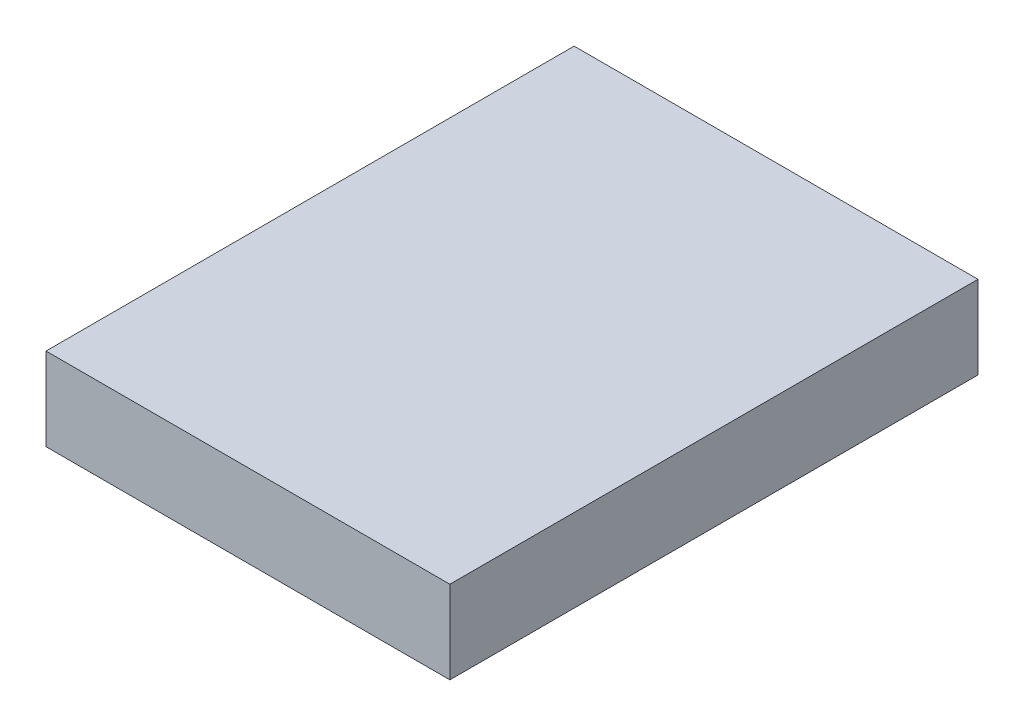
ISO-10303-21;
HEADER;
FILE_DESCRIPTION(('STEP AP214'),'2;1');
FILE_NAME('part.step','',(''),(''),'','','');
FILE_SCHEMA(('AUTOMOTIVE_DESIGN { 1 0 10303 214 1 1 1 1 }'));
ENDSEC;
DATA;
#1=APPLICATION_CONTEXT('core data for automotive mechanical design processes');
#2=APPLICATION_PROTOCOL_DEFINITION('international standard','automotive_design',2000,#1);
#3=PRODUCT_CONTEXT('',#1,'mechanical');
#4=PRODUCT('Part','Part','',(#3));
#5=PRODUCT_RELATED_PRODUCT_CATEGORY('part','',(#4));
#6=PRODUCT_DEFINITION_FORMATION('','',#4);
#7=PRODUCT_DEFINITION_CONTEXT('part definition',#1,'design');
#8=PRODUCT_DEFINITION('design','',#6,#7);
#9=PRODUCT_DEFINITION_SHAPE('','',#8);
#10=(LENGTH_UNIT() NAMED_UNIT(*) SI_UNIT(.MILLI.,.METRE.));
#11=(NAMED_UNIT(*) PLANE_ANGLE_UNIT() SI_UNIT($,.RADIAN.));
#12=(NAMED_UNIT(*) SI_UNIT($,.STERADIAN.) SOLID_ANGLE_UNIT());
#13=UNCERTAINTY_MEASURE_WITH_UNIT(LENGTH_MEASURE(1.E-05),#10,'distance_accuracy_value','');
#14=(GEOMETRIC_REPRESENTATION_CONTEXT(3) GLOBAL_UNCERTAINTY_ASSIGNED_CONTEXT((#13)) GLOBAL_UNIT_ASSIGNED_CONTEXT((#10,
#11,#12)) REPRESENTATION_CONTEXT('',''));
#15=CARTESIAN_POINT('',(0.,0.,0.));
#16=DIRECTION('',(0.,0.,1.));
#17=DIRECTION('',(1.,0.,0.));
#18=AXIS2_PLACEMENT_3D('',#15,#16,#17);
#19=CARTESIAN_POINT('',(19.5,8.,-25.5));
#20=DIRECTION('',(-1.,0.,0.));
#21=DIRECTION('',(0.,0.,1.));
#22=AXIS2_PLACEMENT_3D('',#19,#20,#21);
#23=PLANE('',#22);
#24=DIRECTION('',(0.,0.,-1.));
#25=VECTOR('',#24,1.);
#26=CARTESIAN_POINT('',(19.5,0.,-25.5));
#27=LINE('',#26,#25);
#28=CARTESIAN_POINT('',(19.5,0.,25.5));
#29=VERTEX_POINT('',#28);
#30=CARTESIAN_POINT('',(19.5,0.,-25.5));
#31=VERTEX_POINT('',#30);
#32=EDGE_CURVE('E97',#29,#31,#27,.T.);
#33=ORIENTED_EDGE('',*,*,#32,.T.);
#34=DIRECTION('',(0.,-1.,0.));
#35=VECTOR('',#34,1.);
#36=CARTESIAN_POINT('',(19.5,8.,-25.5));
#37=LINE('',#36,#35);
#38=CARTESIAN_POINT('',(19.5,8.,-25.5));
#39=VERTEX_POINT('',#38);
#40=EDGE_CURVE('E11',#39,#31,#37,.T.);
#41=ORIENTED_EDGE('',*,*,#40,.F.);
#42=DIRECTION('',(0.,0.,-1.));
#43=VECTOR('',#42,1.);
#44=CARTESIAN_POINT('',(19.5,8.,-25.5));
#45=LINE('',#44,#43);
#46=CARTESIAN_POINT('',(19.5,8.,25.5));
#47=VERTEX_POINT('',#46);
#48=EDGE_CURVE('E85',#47,#39,#45,.T.);
#49=ORIENTED_EDGE('',*,*,#48,.F.);
#50=DIRECTION('',(0.,-1.,0.));
#51=VECTOR('',#50,1.);
#52=CARTESIAN_POINT('',(19.5,8.,25.5));
#53=LINE('',#52,#51);
#54=EDGE_CURVE('E93',#47,#29,#53,.T.);
#55=ORIENTED_EDGE('',*,*,#54,.T.);
#56=EDGE_LOOP('',(#33,#41,#49,#55));
#57=FACE_BOUND('',#56,.T.);
#58=ADVANCED_FACE('F34',(#57),#23,.F.);
#59=CARTESIAN_POINT('',(-19.5,8.,-25.5));
#60=DIRECTION('',(0.,0.,1.));
#61=DIRECTION('',(1.,0.,0.));
#62=AXIS2_PLACEMENT_3D('',#59,#60,#61);
#63=PLANE('',#62);
#64=DIRECTION('',(-1.,0.,0.));
#65=VECTOR('',#64,1.);
#66=CARTESIAN_POINT('',(-19.5,0.,-25.5));
#67=LINE('',#66,#65);
#68=CARTESIAN_POINT('',(-19.5,0.,-25.5));
#69=VERTEX_POINT('',#68);
#70=EDGE_CURVE('E89',#31,#69,#67,.T.);
#71=ORIENTED_EDGE('',*,*,#70,.T.);
#72=DIRECTION('',(0.,-1.,0.));
#73=VECTOR('',#72,1.);
#74=CARTESIAN_POINT('',(-19.5,8.,-25.5));
#75=LINE('',#74,#73);
#76=CARTESIAN_POINT('',(-19.5,8.,-25.5));
#77=VERTEX_POINT('',#76);
#78=EDGE_CURVE('E42',#77,#69,#75,.T.);
#79=ORIENTED_EDGE('',*,*,#78,.F.);
#80=DIRECTION('',(-1.,0.,0.));
#81=VECTOR('',#80,1.);
#82=CARTESIAN_POINT('',(-19.5,8.,-25.5));
#83=LINE('',#82,#81);
#84=EDGE_CURVE('E80',#39,#77,#83,.T.);
#85=ORIENTED_EDGE('',*,*,#84,.F.);
#86=ORIENTED_EDGE('',*,*,#40,.T.);
#87=EDGE_LOOP('',(#71,#79,#85,#86));
#88=FACE_BOUND('',#87,.T.);
#89=ADVANCED_FACE('F88',(#88),#63,.F.);
#90=CARTESIAN_POINT('',(-19.5,8.,-25.5));
#91=DIRECTION('',(1.,0.,0.));
#92=DIRECTION('',(0.,0.,-1.));
#93=AXIS2_PLACEMENT_3D('',#90,#91,#92);
#94=PLANE('',#93);
#95=DIRECTION('',(0.,0.,1.));
#96=VECTOR('',#95,1.);
#97=CARTESIAN_POINT('',(-19.5,0.,-25.5));
#98=LINE('',#97,#96);
#99=CARTESIAN_POINT('',(-19.5,0.,25.5));
#100=VERTEX_POINT('',#99);
#101=EDGE_CURVE('E67',#69,#100,#98,.T.);
#102=ORIENTED_EDGE('',*,*,#101,.T.);
#103=DIRECTION('',(0.,-1.,0.));
#104=VECTOR('',#103,1.);
#105=CARTESIAN_POINT('',(-19.5,8.,25.5));
#106=LINE('',#105,#104);
#107=CARTESIAN_POINT('',(-19.5,8.,25.5));
#108=VERTEX_POINT('',#107);
#109=EDGE_CURVE('E90',#108,#100,#106,.T.);
#110=ORIENTED_EDGE('',*,*,#109,.F.);
#111=DIRECTION('',(0.,0.,1.));
#112=VECTOR('',#111,1.);
#113=CARTESIAN_POINT('',(-19.5,8.,-25.5));
#114=LINE('',#113,#112);
#115=EDGE_CURVE('E83',#77,#108,#114,.T.);
#116=ORIENTED_EDGE('',*,*,#115,.F.);
#117=ORIENTED_EDGE('',*,*,#78,.T.);
#118=EDGE_LOOP('',(#102,#110,#116,#117));
#119=FACE_BOUND('',#118,.T.);
#120=ADVANCED_FACE('F91',(#119),#94,.F.);
#121=CARTESIAN_POINT('',(-19.5,8.,25.5));
#122=DIRECTION('',(0.,0.,-1.));
#123=DIRECTION('',(-1.,0.,0.));
#124=AXIS2_PLACEMENT_3D('',#121,#122,#123);
#125=PLANE('',#124);
#126=DIRECTION('',(1.,0.,0.));
#127=VECTOR('',#126,1.);
#128=CARTESIAN_POINT('',(-19.5,0.,25.5));
#129=LINE('',#128,#127);
#130=EDGE_CURVE('E73',#100,#29,#129,.T.);
#131=ORIENTED_EDGE('',*,*,#130,.T.);
#132=ORIENTED_EDGE('',*,*,#54,.F.);
#133=DIRECTION('',(1.,0.,0.));
#134=VECTOR('',#133,1.);
#135=CARTESIAN_POINT('',(-19.5,8.,25.5));
#136=LINE('',#135,#134);
#137=EDGE_CURVE('E50',#108,#47,#136,.T.);
#138=ORIENTED_EDGE('',*,*,#137,.F.);
#139=ORIENTED_EDGE('',*,*,#109,.T.);
#140=EDGE_LOOP('',(#131,#132,#138,#139));
#141=FACE_BOUND('',#140,.T.);
#142=ADVANCED_FACE('F104',(#141),#125,.F.);
#143=CARTESIAN_POINT('',(0.,8.,0.));
#144=DIRECTION('',(0.,1.,0.));
#145=DIRECTION('',(0.,0.,1.));
#146=AXIS2_PLACEMENT_3D('',#143,#144,#145);
#147=PLANE('',#146);
#148=ORIENTED_EDGE('',*,*,#48,.T.);
#149=ORIENTED_EDGE('',*,*,#84,.T.);
#150=ORIENTED_EDGE('',*,*,#115,.T.);
#151=ORIENTED_EDGE('',*,*,#137,.T.);
#152=EDGE_LOOP('',(#148,#149,#150,#151));
#153=FACE_BOUND('',#152,.T.);
#154=ADVANCED_FACE('F81',(#153),#147,.T.);
#155=CARTESIAN_POINT('',(0.,0.,0.));
#156=DIRECTION('',(0.,1.,0.));
#157=DIRECTION('',(0.,0.,1.));
#158=AXIS2_PLACEMENT_3D('',#155,#156,#157);
#159=PLANE('',#158);
#160=ORIENTED_EDGE('',*,*,#32,.F.);
#161=ORIENTED_EDGE('',*,*,#130,.F.);
#162=ORIENTED_EDGE('',*,*,#101,.F.);
#163=ORIENTED_EDGE('',*,*,#70,.F.);
#164=EDGE_LOOP('',(#160,#161,#162,#163));
#165=FACE_BOUND('',#164,.T.);
#166=ADVANCED_FACE('F107',(#165),#159,.F.);
#167=CLOSED_SHELL('',(#58,#89,#120,#142,#154,#166));
#168=MANIFOLD_SOLID_BREP('B2',#167);
#169=ADVANCED_BREP_SHAPE_REPRESENTATION('',(#18,#168),#14);
#170=SHAPE_DEFINITION_REPRESENTATION(#9,#169);
ENDSEC;
END-ISO-10303-21;
